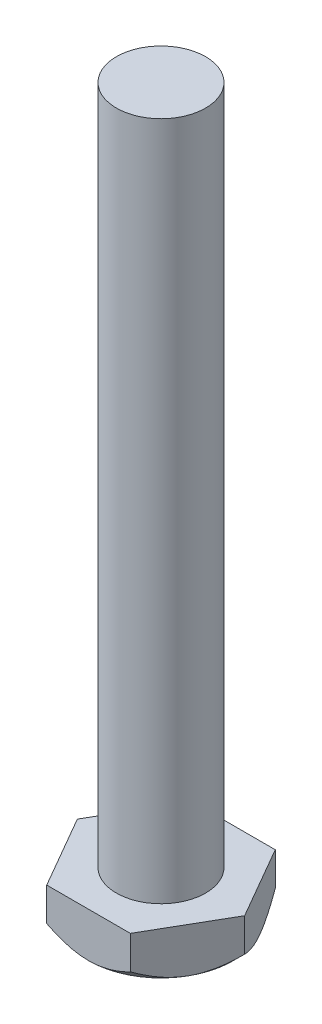
ISO-10303-21;
HEADER;
FILE_DESCRIPTION(('STEP AP214'),'2;1');
FILE_NAME('part.step','',(''),(''),'','','');
FILE_SCHEMA(('AUTOMOTIVE_DESIGN { 1 0 10303 214 1 1 1 1 }'));
ENDSEC;
DATA;
#1=APPLICATION_CONTEXT('core data for automotive mechanical design processes');
#2=APPLICATION_PROTOCOL_DEFINITION('international standard','automotive_design',2000,#1);
#3=PRODUCT_CONTEXT('',#1,'mechanical');
#4=PRODUCT('Part','Part','',(#3));
#5=PRODUCT_RELATED_PRODUCT_CATEGORY('part','',(#4));
#6=PRODUCT_DEFINITION_FORMATION('','',#4);
#7=PRODUCT_DEFINITION_CONTEXT('part definition',#1,'design');
#8=PRODUCT_DEFINITION('design','',#6,#7);
#9=PRODUCT_DEFINITION_SHAPE('','',#8);
#10=(LENGTH_UNIT() NAMED_UNIT(*) SI_UNIT(.MILLI.,.METRE.));
#11=(NAMED_UNIT(*) PLANE_ANGLE_UNIT() SI_UNIT($,.RADIAN.));
#12=(NAMED_UNIT(*) SI_UNIT($,.STERADIAN.) SOLID_ANGLE_UNIT());
#13=UNCERTAINTY_MEASURE_WITH_UNIT(LENGTH_MEASURE(1.E-05),#10,'distance_accuracy_value','');
#14=(GEOMETRIC_REPRESENTATION_CONTEXT(3) GLOBAL_UNCERTAINTY_ASSIGNED_CONTEXT((#13)) GLOBAL_UNIT_ASSIGNED_CONTEXT((#10,
#11,#12)) REPRESENTATION_CONTEXT('',''));
#15=CARTESIAN_POINT('',(0.,0.,0.));
#16=DIRECTION('',(0.,0.,1.));
#17=DIRECTION('',(1.,0.,0.));
#18=AXIS2_PLACEMENT_3D('',#15,#16,#17);
#19=CARTESIAN_POINT('',(3.75277674973264,4.,6.49999999999995));
#20=DIRECTION('',(-0.866025403784441,0.,-0.499999999999995));
#21=DIRECTION('',(-0.499999999999995,0.,0.866025403784442));
#22=AXIS2_PLACEMENT_3D('',#19,#20,#21);
#23=PLANE('',#22);
#24=CARTESIAN_POINT('',(7.50566896951896,1.0056689721836,-0.000200000000000188));
#25=CARTESIAN_POINT('',(7.44114269273982,0.941149402874407,0.111562789804733));
#26=CARTESIAN_POINT('',(7.37612043724036,0.878609848905481,0.224184639952523));
#27=CARTESIAN_POINT('',(7.2449866664783,0.75809308092131,0.451314993500497));
#28=CARTESIAN_POINT('',(7.1788745798115,0.700118358641629,0.5658244866018));
#29=CARTESIAN_POINT('',(6.97814343618827,0.533450528365053,0.913501026018646));
#30=CARTESIAN_POINT('',(6.84182510054323,0.432724757185491,1.14961130935908));
#31=CARTESIAN_POINT('',(6.56692828231375,0.260238848219232,1.62574656537158));
#32=CARTESIAN_POINT('',(6.42842005976328,0.188044164374394,1.86564984409505));
#33=CARTESIAN_POINT('',(6.21838062585921,0.104532676462896,2.2294488152099));
#34=CARTESIAN_POINT('',(6.14805824913179,0.0808367714070053,2.3512507446108));
#35=CARTESIAN_POINT('',(6.00681807563203,0.0422413530035401,2.59588590118223));
#36=CARTESIAN_POINT('',(5.93590036944922,0.0273405250891793,2.7187189714471));
#37=CARTESIAN_POINT('',(5.76308336321239,0.00235711731830176,3.01804680666123));
#38=CARTESIAN_POINT('',(5.66099785946114,-0.00288483734236224,3.19486408587467));
#39=CARTESIAN_POINT('',(5.45701084907491,0.0059137350142073,3.54817995194772));
#40=CARTESIAN_POINT('',(5.35510941947299,0.0199610212491435,3.72467840538215));
#41=CARTESIAN_POINT('',(5.15226727402367,0.0665100411890715,4.07601130721665));
#42=CARTESIAN_POINT('',(5.05132776109957,0.0990324122885824,4.25084367209243));
#43=CARTESIAN_POINT('',(4.85118364029871,0.180763482077609,4.59750345815574));
#44=CARTESIAN_POINT('',(4.75197890000286,0.229970901261828,4.76933110869983));
#45=CARTESIAN_POINT('',(4.57587338891246,0.331205260894986,5.0743548014013));
#46=CARTESIAN_POINT('',(4.49858265374504,0.380569685623974,5.20822628166561));
#47=CARTESIAN_POINT('',(4.34538863071072,0.487253389448814,5.47356611297694));
#48=CARTESIAN_POINT('',(4.26948538498531,0.544572909707867,5.60503439103272));
#49=CARTESIAN_POINT('',(4.11930541101731,0.665881927007233,5.86515373622469));
#50=CARTESIAN_POINT('',(4.04502441158784,0.72985044836631,5.99381220127353));
#51=CARTESIAN_POINT('',(3.89783787777878,0.863617647857271,6.24874675602078));
#52=CARTESIAN_POINT('',(3.82493153304269,0.933412750560145,6.37502424929781));
#53=CARTESIAN_POINT('',(3.7526612796788,1.0056689721836,6.50019999999995));
#54=B_SPLINE_CURVE_WITH_KNOTS('',3,(#24,#25,#26,#27,#28,#29,#30,#31,#32,#33,#34,#35,#36,#37,#38,
#39,#40,#41,#42,#43,#44,#45,#46,#47,#48,#49,#50,#51,#52,#53),.UNSPECIFIED.,.F.,.F.,(4,2,2,2,2,2,
2,2,2,2,2,2,2,2,4),(0.,0.432821098198447,0.865876839223418,1.73666364694239,2.59362329760354,
3.02126269407583,3.44883815671479,4.06060100939774,4.67257828698745,5.28524051521263,
5.89785577160168,6.38444407043265,6.87104712368545,7.35615917312017,7.84097569580784),.UNSPECIFIED.);
#55=CARTESIAN_POINT('',(7.50555349946513,1.00555349946511,0.));
#56=VERTEX_POINT('',#55);
#57=CARTESIAN_POINT('',(5.62916512459888,0.,3.24999999999998));
#58=VERTEX_POINT('',#57);
#59=EDGE_CURVE('E58',#56,#58,#54,.T.);
#60=ORIENTED_EDGE('',*,*,#59,.F.);
#61=DIRECTION('',(0.,-1.,0.));
#62=VECTOR('',#61,1.);
#63=CARTESIAN_POINT('',(7.50555349946513,4.,0.));
#64=LINE('',#63,#62);
#65=CARTESIAN_POINT('',(7.50555349946513,4.,0.));
#66=VERTEX_POINT('',#65);
#67=EDGE_CURVE('E162',#66,#56,#64,.T.);
#68=ORIENTED_EDGE('',*,*,#67,.F.);
#69=DIRECTION('',(0.499999999999995,0.,-0.866025403784442));
#70=VECTOR('',#69,1.);
#71=CARTESIAN_POINT('',(3.75277674973264,4.,6.49999999999995));
#72=LINE('',#71,#70);
#73=CARTESIAN_POINT('',(3.75277674973264,4.,6.49999999999995));
#74=VERTEX_POINT('',#73);
#75=EDGE_CURVE('E295',#74,#66,#72,.T.);
#76=ORIENTED_EDGE('',*,*,#75,.F.);
#77=DIRECTION('',(0.,-1.,0.));
#78=VECTOR('',#77,1.);
#79=CARTESIAN_POINT('',(3.75277674973264,4.,6.49999999999995));
#80=LINE('',#79,#78);
#81=CARTESIAN_POINT('',(3.75277674973264,1.00555349946511,6.49999999999995));
#82=VERTEX_POINT('',#81);
#83=EDGE_CURVE('E146',#74,#82,#80,.T.);
#84=ORIENTED_EDGE('',*,*,#83,.T.);
#85=EDGE_CURVE('E139',#58,#82,#54,.T.);
#86=ORIENTED_EDGE('',*,*,#85,.F.);
#87=EDGE_LOOP('',(#60,#68,#76,#84,#86));
#88=FACE_BOUND('',#87,.T.);
#89=ADVANCED_FACE('F40',(#88),#23,.F.);
#90=CARTESIAN_POINT('',(7.50555349946513,4.,0.));
#91=DIRECTION('',(-0.866025403784438,0.,0.500000000000001));
#92=DIRECTION('',(0.500000000000001,0.,0.866025403784438));
#93=AXIS2_PLACEMENT_3D('',#90,#91,#92);
#94=PLANE('',#93);
#95=CARTESIAN_POINT('',(3.75266127967871,1.0056689721836,-6.5002));
#96=CARTESIAN_POINT('',(3.81718755645786,0.941149402874405,-6.38843721019527));
#97=CARTESIAN_POINT('',(3.88220981195732,0.878609848905476,-6.27581536004748));
#98=CARTESIAN_POINT('',(4.01334358271938,0.758093080921304,-6.0486850064995));
#99=CARTESIAN_POINT('',(4.07945566938618,0.700118358641621,-5.9341755133982));
#100=CARTESIAN_POINT('',(4.28018681300942,0.533450528365042,-5.58649897398135));
#101=CARTESIAN_POINT('',(4.41650514865445,0.432724757185478,-5.35038869064092));
#102=CARTESIAN_POINT('',(4.69140196688395,0.260238848219214,-4.87425343462841));
#103=CARTESIAN_POINT('',(4.82991018943442,0.188044164374374,-4.63435015590493));
#104=CARTESIAN_POINT('',(5.03994962333849,0.104532676462874,-4.27055118479008));
#105=CARTESIAN_POINT('',(5.11027200006591,0.0808367714069831,-4.14874925538919));
#106=CARTESIAN_POINT('',(5.25151217356568,0.0422413530035163,-3.90411409881775));
#107=CARTESIAN_POINT('',(5.32242987974849,0.0273405250891544,-3.78128102855288));
#108=CARTESIAN_POINT('',(5.49524688598532,0.00235711731827581,-3.48195319333875));
#109=CARTESIAN_POINT('',(5.59733238973657,-0.00288483734238767,-3.30513591412531));
#110=CARTESIAN_POINT('',(5.80131940012281,0.00591373501418112,-2.95182004805227));
#111=CARTESIAN_POINT('',(5.90322082972473,0.0199610212491159,-2.77532159461784));
#112=CARTESIAN_POINT('',(6.10606297517405,0.0665100411890426,-2.42398869278334));
#113=CARTESIAN_POINT('',(6.20700248809814,0.0990324122885535,-2.24915632790756));
#114=CARTESIAN_POINT('',(6.40714660889901,0.18076348207758,-1.90249654184425));
#115=CARTESIAN_POINT('',(6.50635134919486,0.229970901261798,-1.73066889130016));
#116=CARTESIAN_POINT('',(6.68245686028527,0.331205260894957,-1.4256451985987));
#117=CARTESIAN_POINT('',(6.75974759545269,0.380569685623947,-1.29177371833437));
#118=CARTESIAN_POINT('',(6.91294161848702,0.487253389448791,-1.02643388702304));
#119=CARTESIAN_POINT('',(6.98884486421242,0.544572909707847,-0.89496560896725));
#120=CARTESIAN_POINT('',(7.13902483818044,0.665881927007219,-0.63484626377528));
#121=CARTESIAN_POINT('',(7.21330583760991,0.729850448366299,-0.506187798726435));
#122=CARTESIAN_POINT('',(7.36049237141898,0.863617647857267,-0.251253243979176));
#123=CARTESIAN_POINT('',(7.43339871615507,0.933412750560144,-0.124975750702143));
#124=CARTESIAN_POINT('',(7.50566896951896,1.0056689721836,0.00020000000000026));
#125=B_SPLINE_CURVE_WITH_KNOTS('',3,(#95,#96,#97,#98,#99,#100,#101,#102,#103,#104,#105,#106,
#107,#108,#109,#110,#111,#112,#113,#114,#115,#116,#117,#118,#119,#120,#121,#122,#123,#124),
.UNSPECIFIED.,.F.,.F.,(4,2,2,2,2,2,2,2,2,2,2,2,2,2,4),(0.,0.432821098198453,0.86587683922343,
1.73666364694241,2.59362329760358,3.02126269407586,3.44883815671483,4.06060100939778,
4.67257828698749,5.28524051521267,5.89785577160171,6.3844440704327,6.87104712368552,
7.35615917312026,7.84097569580794),.UNSPECIFIED.);
#126=CARTESIAN_POINT('',(3.75277674973255,1.00555349946511,-6.5));
#127=VERTEX_POINT('',#126);
#128=CARTESIAN_POINT('',(5.62916512459886,0.,-3.25000000000001));
#129=VERTEX_POINT('',#128);
#130=EDGE_CURVE('E66',#127,#129,#125,.T.);
#131=ORIENTED_EDGE('',*,*,#130,.F.);
#132=DIRECTION('',(0.,-1.,0.));
#133=VECTOR('',#132,1.);
#134=CARTESIAN_POINT('',(3.75277674973255,4.,-6.5));
#135=LINE('',#134,#133);
#136=CARTESIAN_POINT('',(3.75277674973255,4.,-6.5));
#137=VERTEX_POINT('',#136);
#138=EDGE_CURVE('E159',#137,#127,#135,.T.);
#139=ORIENTED_EDGE('',*,*,#138,.F.);
#140=DIRECTION('',(-0.500000000000001,0.,-0.866025403784438));
#141=VECTOR('',#140,1.);
#142=CARTESIAN_POINT('',(7.50555349946513,4.,0.));
#143=LINE('',#142,#141);
#144=EDGE_CURVE('E296',#66,#137,#143,.T.);
#145=ORIENTED_EDGE('',*,*,#144,.F.);
#146=ORIENTED_EDGE('',*,*,#67,.T.);
#147=EDGE_CURVE('E205',#129,#56,#125,.T.);
#148=ORIENTED_EDGE('',*,*,#147,.F.);
#149=EDGE_LOOP('',(#131,#139,#145,#146,#148));
#150=FACE_BOUND('',#149,.T.);
#151=ADVANCED_FACE('F259',(#150),#94,.F.);
#152=CARTESIAN_POINT('',(3.75277674973255,4.,-6.5));
#153=DIRECTION('',(0.,0.,1.));
#154=DIRECTION('',(1.,0.,0.));
#155=AXIS2_PLACEMENT_3D('',#152,#153,#154);
#156=PLANE('',#155);
#157=CARTESIAN_POINT('',(-12.257877297848,7.37463714297044,-6.49999999999995));
#158=CARTESIAN_POINT('',(-12.0786144527424,7.21626669926706,-6.49999999999995));
#159=CARTESIAN_POINT('',(-11.8989773365282,7.05832020377098,-6.49999999999995));
#160=CARTESIAN_POINT('',(-11.5388532991319,6.74339438513113,-6.49999999999995));
#161=CARTESIAN_POINT('',(-11.3583663667321,6.58641507481787,-6.49999999999995));
#162=CARTESIAN_POINT('',(-10.8153431385367,6.11698954789332,-6.49999999999995));
#163=CARTESIAN_POINT('',(-10.451385856912,5.80618102592782,-6.49999999999995));
#164=CARTESIAN_POINT('',(-9.712810821166,5.18537617821584,-6.49999999999996));
#165=CARTESIAN_POINT('',(-9.33811561999247,4.87547183042592,-6.49999999999996));
#166=CARTESIAN_POINT('',(-8.58232837140268,4.26368607674633,-6.49999999999996));
#167=CARTESIAN_POINT('',(-8.20123778767632,3.96180287486343,-6.49999999999996));
#168=CARTESIAN_POINT('',(-7.62881004902885,3.52170439750737,-6.49999999999996));
#169=CARTESIAN_POINT('',(-7.44075642357074,3.37921757786601,-6.49999999999996));
#170=CARTESIAN_POINT('',(-7.06230131506511,3.09740132203368,-6.49999999999996));
#171=CARTESIAN_POINT('',(-6.87189990270703,2.95807179113673,-6.49999999999996));
#172=CARTESIAN_POINT('',(-6.48823632621301,2.68309877395636,-6.49999999999997));
#173=CARTESIAN_POINT('',(-6.29497216843928,2.54745806290806,-6.49999999999997));
#174=CARTESIAN_POINT('',(-5.90528537918821,2.28078594002991,-6.49999999999997));
#175=CARTESIAN_POINT('',(-5.70886281069725,2.14975443644699,-6.49999999999997));
#176=CARTESIAN_POINT('',(-5.31322817211592,1.89390975989261,-6.49999999999997));
#177=CARTESIAN_POINT('',(-5.11403231933556,1.76907160556493,-6.49999999999997));
#178=CARTESIAN_POINT('',(-4.71141947544237,1.52631126714523,-6.49999999999997));
#179=CARTESIAN_POINT('',(-4.50800203451751,1.40838982520712,-6.49999999999997));
#180=CARTESIAN_POINT('',(-4.09661663066175,1.18133314664702,-6.49999999999997));
#181=CARTESIAN_POINT('',(-3.88865455670888,1.07218730816967,-6.49999999999997));
#182=CARTESIAN_POINT('',(-3.46742405503234,0.864743184214765,-6.49999999999998));
#183=CARTESIAN_POINT('',(-3.25415739730938,0.766441338340335,-6.49999999999998));
#184=CARTESIAN_POINT('',(-2.83635448210288,0.589538565413004,-6.49999999999998));
#185=CARTESIAN_POINT('',(-2.63219405877725,0.510057834807899,-6.49999999999998));
#186=CARTESIAN_POINT('',(-2.21876891448566,0.365526540690359,-6.49999999999998));
#187=CARTESIAN_POINT('',(-2.00950432269849,0.300475612401178,-6.49999999999998));
#188=CARTESIAN_POINT('',(-1.5874297362605,0.187961396848507,-6.49999999999998));
#189=CARTESIAN_POINT('',(-1.37464472488329,0.14040580261359,-6.49999999999998));
#190=CARTESIAN_POINT('',(-0.945577231612609,0.0650260309861006,-6.49999999999998));
#191=CARTESIAN_POINT('',(-0.729295257552785,0.037199014443615,-6.49999999999998));
#192=CARTESIAN_POINT('',(-0.292586234689799,0.00290209125437749,-6.49999999999999));
#193=CARTESIAN_POINT('',(-0.07213983673658,-0.00332688791294952,-6.49999999999999));
#194=CARTESIAN_POINT('',(0.368231291401837,0.0066983795295759,-6.49999999999999));
#195=CARTESIAN_POINT('',(0.588156014841029,0.0229529153131664,-6.49999999999999));
#196=CARTESIAN_POINT('',(1.02618641602243,0.0768982451446449,-6.49999999999999));
#197=CARTESIAN_POINT('',(1.24428159032241,0.114672779444712,-6.49999999999999));
#198=CARTESIAN_POINT('',(1.67624769873432,0.209346557704701,-6.49999999999999));
#199=CARTESIAN_POINT('',(1.89011762963223,0.266250287143196,-6.49999999999999));
#200=CARTESIAN_POINT('',(2.4105279834602,0.426334256625288,-6.5));
#201=CARTESIAN_POINT('',(2.71421266224958,0.53874726670331,-6.5));
#202=CARTESIAN_POINT('',(3.31063302640746,0.789503332084321,-6.5));
#203=CARTESIAN_POINT('',(3.60336017118192,0.927866128498037,-6.5));
#204=CARTESIAN_POINT('',(4.18133418955161,1.22473967674961,-6.5));
#205=CARTESIAN_POINT('',(4.46649966923663,1.38340688038837,-6.5));
#206=CARTESIAN_POINT('',(5.02832154749166,1.71478028036426,-6.5));
#207=CARTESIAN_POINT('',(5.30498091055152,1.88748150743655,-6.50000000000001));
#208=CARTESIAN_POINT('',(5.88304602169086,2.26394314930452,-6.50000000000001));
#209=CARTESIAN_POINT('',(6.18361170490619,2.46898531148202,-6.50000000000001));
#210=CARTESIAN_POINT('',(6.77799667458418,2.88866409616432,-6.50000000000001));
#211=CARTESIAN_POINT('',(7.07181479673363,3.10330235595505,-6.50000000000001));
#212=CARTESIAN_POINT('',(7.65431710997908,3.53999067144228,-6.50000000000001));
#213=CARTESIAN_POINT('',(7.94299600430426,3.7620477641512,-6.50000000000001));
#214=CARTESIAN_POINT('',(8.51600164960845,4.21171212211462,-6.50000000000002));
#215=CARTESIAN_POINT('',(8.80032823653066,4.4393195957519,-6.50000000000002));
#216=CARTESIAN_POINT('',(9.35293754376002,4.88871218817845,-6.50000000000002));
#217=CARTESIAN_POINT('',(9.62137350518937,5.11030932245183,-6.50000000000002));
#218=CARTESIAN_POINT('',(10.1555756083284,5.55670815411302,-6.50000000000002));
#219=CARTESIAN_POINT('',(10.4213416796926,5.78150993556035,-6.50000000000002));
#220=CARTESIAN_POINT('',(10.949977862199,6.23315174604503,-6.50000000000002));
#221=CARTESIAN_POINT('',(11.212853574311,6.45998522969075,-6.50000000000002));
#222=CARTESIAN_POINT('',(11.7367031120537,6.91580200128775,-6.50000000000003));
#223=CARTESIAN_POINT('',(11.997677069744,7.14478513738901,-6.50000000000003));
#224=CARTESIAN_POINT('',(12.2578772978479,7.37463714297044,-6.50000000000003));
#225=B_SPLINE_CURVE_WITH_KNOTS('',3,(#157,#158,#159,#160,#161,#162,#163,#164,#165,#166,#167,
#168,#169,#170,#171,#172,#173,#174,#175,#176,#177,#178,#179,#180,#181,#182,#183,#184,#185,#186,
#187,#188,#189,#190,#191,#192,#193,#194,#195,#196,#197,#198,#199,#200,#201,#202,#203,#204,#205,
#206,#207,#208,#209,#210,#211,#212,#213,#214,#215,#216,#217,#218,#219,#220,#221,#222,#223,#224),
.UNSPECIFIED.,.F.,.F.,(4,2,2,2,2,2,2,2,2,2,2,2,2,2,2,2,2,2,2,2,2,2,2,2,2,2,2,2,2,2,2,2,2,4),(0.,
0.717596745114868,1.43520298932425,2.87098231527432,4.32965602473858,5.78800032614762,
6.49578815940556,7.20355473369043,7.9118398287353,8.62011081633329,9.32524337472437,
10.0304514550019,10.7347943515658,11.4389052993018,12.095719816132,12.7525177271926,
13.4057988526736,14.0589859450329,14.7194363436416,15.3798952367711,16.0429418856771,
16.7061441165826,17.675873747876,18.6463441084639,19.6248017573319,20.6029144442506,
21.6941878900879,22.7856482448939,23.878175044857,24.9707429258457,26.0149681831964,
27.0592208816857,28.100848181947,29.142402447864),.UNSPECIFIED.);
#226=CARTESIAN_POINT('',(-3.75277674973259,1.00555349946511,-6.49999999999997));
#227=VERTEX_POINT('',#226);
#228=CARTESIAN_POINT('',(0.,0.,-6.50000000000001));
#229=VERTEX_POINT('',#228);
#230=EDGE_CURVE('E187',#227,#229,#225,.T.);
#231=ORIENTED_EDGE('',*,*,#230,.F.);
#232=DIRECTION('',(0.,-1.,0.));
#233=VECTOR('',#232,1.);
#234=CARTESIAN_POINT('',(-3.75277674973259,4.,-6.49999999999997));
#235=LINE('',#234,#233);
#236=CARTESIAN_POINT('',(-3.75277674973259,4.,-6.49999999999997));
#237=VERTEX_POINT('',#236);
#238=EDGE_CURVE('E150',#237,#227,#235,.T.);
#239=ORIENTED_EDGE('',*,*,#238,.F.);
#240=DIRECTION('',(-1.,0.,0.));
#241=VECTOR('',#240,1.);
#242=CARTESIAN_POINT('',(3.75277674973255,4.,-6.5));
#243=LINE('',#242,#241);
#244=EDGE_CURVE('E301',#137,#237,#243,.T.);
#245=ORIENTED_EDGE('',*,*,#244,.F.);
#246=ORIENTED_EDGE('',*,*,#138,.T.);
#247=EDGE_CURVE('E200',#229,#127,#225,.T.);
#248=ORIENTED_EDGE('',*,*,#247,.F.);
#249=EDGE_LOOP('',(#231,#239,#245,#246,#248));
#250=FACE_BOUND('',#249,.T.);
#251=ADVANCED_FACE('F262',(#250),#156,.F.);
#252=CARTESIAN_POINT('',(-3.75277674973259,4.,-6.49999999999997));
#253=DIRECTION('',(0.866025403784441,0.,0.499999999999995));
#254=DIRECTION('',(0.499999999999995,0.,-0.866025403784442));
#255=AXIS2_PLACEMENT_3D('',#252,#253,#254);
#256=PLANE('',#255);
#257=CARTESIAN_POINT('',(-7.50566896951896,1.0056689721836,0.000200000000052411));
#258=CARTESIAN_POINT('',(-7.44114269273982,0.941149402874404,-0.111562789804681));
#259=CARTESIAN_POINT('',(-7.37612043724036,0.878609848905476,-0.224184639952472));
#260=CARTESIAN_POINT('',(-7.2449866664783,0.758093080921304,-0.451314993500448));
#261=CARTESIAN_POINT('',(-7.1788745798115,0.700118358641621,-0.565824486601752));
#262=CARTESIAN_POINT('',(-6.97814343618826,0.533450528365042,-0.913501026018603));
#263=CARTESIAN_POINT('',(-6.84182510054323,0.432724757185477,-1.14961130935903));
#264=CARTESIAN_POINT('',(-6.56692828231374,0.260238848219213,-1.62574656537154));
#265=CARTESIAN_POINT('',(-6.42842005976327,0.188044164374373,-1.86564984409502));
#266=CARTESIAN_POINT('',(-6.2183806258592,0.104532676462873,-2.22944881520987));
#267=CARTESIAN_POINT('',(-6.14805824913178,0.0808367714069826,-2.35125074461077));
#268=CARTESIAN_POINT('',(-6.00681807563201,0.042241353003516,-2.59588590118221));
#269=CARTESIAN_POINT('',(-5.9359003694492,0.0273405250891542,-2.71871897144707));
#270=CARTESIAN_POINT('',(-5.76308336321238,0.0023571173182752,-3.01804680666121));
#271=CARTESIAN_POINT('',(-5.66099785946112,-0.00288483734238883,-3.19486408587464));
#272=CARTESIAN_POINT('',(-5.45701084907489,0.00591373501418011,-3.54817995194769));
#273=CARTESIAN_POINT('',(-5.35510941947297,0.0199610212491156,-3.72467840538212));
#274=CARTESIAN_POINT('',(-5.15226727402365,0.0665100411890429,-4.07601130721662));
#275=CARTESIAN_POINT('',(-5.05132776109956,0.0990324122885538,-4.25084367209241));
#276=CARTESIAN_POINT('',(-4.85118364029869,0.18076348207758,-4.59750345815572));
#277=CARTESIAN_POINT('',(-4.75197890000284,0.229970901261799,-4.7693311086998));
#278=CARTESIAN_POINT('',(-4.57587338891244,0.331205260894957,-5.07435480140127));
#279=CARTESIAN_POINT('',(-4.49858265374502,0.380569685623947,-5.2082262816656));
#280=CARTESIAN_POINT('',(-4.34538863071069,0.487253389448791,-5.47356611297693));
#281=CARTESIAN_POINT('',(-4.26948538498529,0.544572909707847,-5.60503439103272));
#282=CARTESIAN_POINT('',(-4.11930541101727,0.665881927007219,-5.86515373622469));
#283=CARTESIAN_POINT('',(-4.0450244115878,0.729850448366299,-5.99381220127354));
#284=CARTESIAN_POINT('',(-3.89783787777873,0.863617647857266,-6.2487467560208));
#285=CARTESIAN_POINT('',(-3.82493153304265,0.933412750560143,-6.37502424929783));
#286=CARTESIAN_POINT('',(-3.75266127967875,1.0056689721836,-6.50019999999997));
#287=B_SPLINE_CURVE_WITH_KNOTS('',3,(#257,#258,#259,#260,#261,#262,#263,#264,#265,#266,#267,
#268,#269,#270,#271,#272,#273,#274,#275,#276,#277,#278,#279,#280,#281,#282,#283,#284,#285,#286),
.UNSPECIFIED.,.F.,.F.,(4,2,2,2,2,2,2,2,2,2,2,2,2,2,4),(0.,0.432821098198452,0.865876839223429,
1.73666364694241,2.59362329760357,3.02126269407586,3.44883815671483,4.06060100939778,
4.67257828698749,5.28524051521267,5.89785577160172,6.38444407043271,6.87104712368552,
7.35615917312026,7.84097569580794),.UNSPECIFIED.);
#288=CARTESIAN_POINT('',(-7.50555349946512,1.00555349946511,0.));
#289=VERTEX_POINT('',#288);
#290=CARTESIAN_POINT('',(-5.62916512459888,0.,-3.24999999999997));
#291=VERTEX_POINT('',#290);
#292=EDGE_CURVE('E196',#289,#291,#287,.T.);
#293=ORIENTED_EDGE('',*,*,#292,.F.);
#294=DIRECTION('',(0.,-1.,0.));
#295=VECTOR('',#294,1.);
#296=CARTESIAN_POINT('',(-7.50555349946512,4.,0.));
#297=LINE('',#296,#295);
#298=CARTESIAN_POINT('',(-7.50555349946512,4.,0.));
#299=VERTEX_POINT('',#298);
#300=EDGE_CURVE('E145',#299,#289,#297,.T.);
#301=ORIENTED_EDGE('',*,*,#300,.F.);
#302=DIRECTION('',(-0.499999999999995,0.,0.866025403784441));
#303=VECTOR('',#302,1.);
#304=CARTESIAN_POINT('',(-3.75277674973259,4.,-6.49999999999997));
#305=LINE('',#304,#303);
#306=EDGE_CURVE('E306',#237,#299,#305,.T.);
#307=ORIENTED_EDGE('',*,*,#306,.F.);
#308=ORIENTED_EDGE('',*,*,#238,.T.);
#309=EDGE_CURVE('E185',#291,#227,#287,.T.);
#310=ORIENTED_EDGE('',*,*,#309,.F.);
#311=EDGE_LOOP('',(#293,#301,#307,#308,#310));
#312=FACE_BOUND('',#311,.T.);
#313=ADVANCED_FACE('F194',(#312),#256,.F.);
#314=CARTESIAN_POINT('',(-7.50555349946512,4.,0.));
#315=DIRECTION('',(0.866025403784435,0.,-0.500000000000007));
#316=DIRECTION('',(-0.500000000000007,0.,-0.866025403784434));
#317=AXIS2_PLACEMENT_3D('',#314,#315,#316);
#318=PLANE('',#317);
#319=CARTESIAN_POINT('',(-3.75266127967866,1.0056689721836,6.50020000000003));
#320=CARTESIAN_POINT('',(-3.81718755645781,0.941149402874403,6.38843721019529));
#321=CARTESIAN_POINT('',(-3.88220981195727,0.878609848905475,6.2758153600475));
#322=CARTESIAN_POINT('',(-4.01334358271933,0.758093080921303,6.04868500649953));
#323=CARTESIAN_POINT('',(-4.07945566938614,0.700118358641621,5.93417551339823));
#324=CARTESIAN_POINT('',(-4.28018681300938,0.533450528365042,5.58649897398138));
#325=CARTESIAN_POINT('',(-4.41650514865442,0.432724757185478,5.35038869064095));
#326=CARTESIAN_POINT('',(-4.69140196688391,0.260238848219212,4.87425343462845));
#327=CARTESIAN_POINT('',(-4.82991018943439,0.188044164374372,4.63435015590497));
#328=CARTESIAN_POINT('',(-5.03994962333846,0.104532676462873,4.27055118479012));
#329=CARTESIAN_POINT('',(-5.11027200006588,0.0808367714069827,4.14874925538922));
#330=CARTESIAN_POINT('',(-5.25151217356565,0.0422413530035159,3.90411409881779));
#331=CARTESIAN_POINT('',(-5.32242987974846,0.0273405250891534,3.78128102855292));
#332=CARTESIAN_POINT('',(-5.49524688598529,0.00235711731827423,3.48195319333879));
#333=CARTESIAN_POINT('',(-5.59733238973654,-0.00288483734238903,3.30513591412535));
#334=CARTESIAN_POINT('',(-5.80131940012279,0.00591373501418033,2.95182004805231));
#335=CARTESIAN_POINT('',(-5.90322082972471,0.0199610212491156,2.77532159461788));
#336=CARTESIAN_POINT('',(-6.10606297517403,0.0665100411890424,2.42398869278339));
#337=CARTESIAN_POINT('',(-6.20700248809813,0.099032412288553,2.2491563279076));
#338=CARTESIAN_POINT('',(-6.407146608899,0.180763482077579,1.90249654184429));
#339=CARTESIAN_POINT('',(-6.50635134919485,0.229970901261798,1.73066889130021));
#340=CARTESIAN_POINT('',(-6.68245686028526,0.331205260894956,1.42564519859874));
#341=CARTESIAN_POINT('',(-6.75974759545268,0.380569685623946,1.29177371833442));
#342=CARTESIAN_POINT('',(-6.91294161848701,0.48725338944879,1.02643388702309));
#343=CARTESIAN_POINT('',(-6.98884486421242,0.544572909707845,0.894965608967299));
#344=CARTESIAN_POINT('',(-7.13902483818043,0.665881927007217,0.63484626377533));
#345=CARTESIAN_POINT('',(-7.21330583760991,0.729850448366297,0.506187798726486));
#346=CARTESIAN_POINT('',(-7.36049237141898,0.863617647857265,0.251253243979228));
#347=CARTESIAN_POINT('',(-7.43339871615506,0.933412750560142,0.124975750702195));
#348=CARTESIAN_POINT('',(-7.50566896951896,1.0056689721836,-0.00019999999994751));
#349=B_SPLINE_CURVE_WITH_KNOTS('',3,(#319,#320,#321,#322,#323,#324,#325,#326,#327,#328,#329,
#330,#331,#332,#333,#334,#335,#336,#337,#338,#339,#340,#341,#342,#343,#344,#345,#346,#347,#348),
.UNSPECIFIED.,.F.,.F.,(4,2,2,2,2,2,2,2,2,2,2,2,2,2,4),(0.,0.432821098198452,0.865876839223428,
1.73666364694241,2.59362329760357,3.02126269407586,3.44883815671483,4.06060100939778,
4.67257828698749,5.28524051521267,5.89785577160171,6.3844440704327,6.87104712368552,
7.35615917312026,7.84097569580794),.UNSPECIFIED.);
#350=CARTESIAN_POINT('',(-3.7527767497325,1.00555349946511,6.50000000000003));
#351=VERTEX_POINT('',#350);
#352=CARTESIAN_POINT('',(-5.62916512459884,0.,3.25000000000005));
#353=VERTEX_POINT('',#352);
#354=EDGE_CURVE('E119',#351,#353,#349,.T.);
#355=ORIENTED_EDGE('',*,*,#354,.F.);
#356=DIRECTION('',(0.,-1.,0.));
#357=VECTOR('',#356,1.);
#358=CARTESIAN_POINT('',(-3.7527767497325,4.,6.50000000000003));
#359=LINE('',#358,#357);
#360=CARTESIAN_POINT('',(-3.7527767497325,4.,6.50000000000003));
#361=VERTEX_POINT('',#360);
#362=EDGE_CURVE('E134',#361,#351,#359,.T.);
#363=ORIENTED_EDGE('',*,*,#362,.F.);
#364=DIRECTION('',(0.500000000000007,0.,0.866025403784435));
#365=VECTOR('',#364,1.);
#366=CARTESIAN_POINT('',(-7.50555349946512,4.,0.));
#367=LINE('',#366,#365);
#368=EDGE_CURVE('E309',#299,#361,#367,.T.);
#369=ORIENTED_EDGE('',*,*,#368,.F.);
#370=ORIENTED_EDGE('',*,*,#300,.T.);
#371=EDGE_CURVE('E137',#353,#289,#349,.T.);
#372=ORIENTED_EDGE('',*,*,#371,.F.);
#373=EDGE_LOOP('',(#355,#363,#369,#370,#372));
#374=FACE_BOUND('',#373,.T.);
#375=ADVANCED_FACE('F132',(#374),#318,.F.);
#376=CARTESIAN_POINT('',(-3.7527767497325,4.,6.50000000000003));
#377=DIRECTION('',(0.,0.,-1.));
#378=DIRECTION('',(-1.,0.,0.));
#379=AXIS2_PLACEMENT_3D('',#376,#377,#378);
#380=PLANE('',#379);
#381=CARTESIAN_POINT('',(12.257877297848,7.37463714297044,6.49999999999986));
#382=CARTESIAN_POINT('',(12.0786144527424,7.21626669926706,6.49999999999986));
#383=CARTESIAN_POINT('',(11.8989773365282,7.05832020377098,6.49999999999986));
#384=CARTESIAN_POINT('',(11.538853299132,6.74339438513113,6.49999999999986));
#385=CARTESIAN_POINT('',(11.3583663667321,6.58641507481787,6.49999999999987));
#386=CARTESIAN_POINT('',(10.8153431385368,6.11698954789332,6.49999999999987));
#387=CARTESIAN_POINT('',(10.451385856912,5.80618102592782,6.49999999999988));
#388=CARTESIAN_POINT('',(9.71281082116604,5.18537617821584,6.49999999999988));
#389=CARTESIAN_POINT('',(9.33811561999251,4.87547183042592,6.49999999999989));
#390=CARTESIAN_POINT('',(8.58232837140272,4.26368607674633,6.4999999999999));
#391=CARTESIAN_POINT('',(8.20123778767637,3.96180287486343,6.4999999999999));
#392=CARTESIAN_POINT('',(7.6288100490289,3.52170439750736,6.49999999999991));
#393=CARTESIAN_POINT('',(7.44075642357079,3.379217577866,6.49999999999991));
#394=CARTESIAN_POINT('',(7.06230131506516,3.09740132203368,6.49999999999991));
#395=CARTESIAN_POINT('',(6.87189990270707,2.95807179113672,6.49999999999991));
#396=CARTESIAN_POINT('',(6.48823632621305,2.68309877395636,6.49999999999992));
#397=CARTESIAN_POINT('',(6.29497216843932,2.54745806290806,6.49999999999992));
#398=CARTESIAN_POINT('',(5.90528537918826,2.28078594002991,6.49999999999992));
#399=CARTESIAN_POINT('',(5.70886281069729,2.14975443644698,6.49999999999993));
#400=CARTESIAN_POINT('',(5.31322817211596,1.8939097598926,6.49999999999993));
#401=CARTESIAN_POINT('',(5.1140323193356,1.76907160556493,6.49999999999993));
#402=CARTESIAN_POINT('',(4.71141947544241,1.52631126714523,6.49999999999994));
#403=CARTESIAN_POINT('',(4.50800203451755,1.40838982520711,6.49999999999994));
#404=CARTESIAN_POINT('',(4.09661663066179,1.18133314664702,6.49999999999994));
#405=CARTESIAN_POINT('',(3.88865455670892,1.07218730816967,6.49999999999994));
#406=CARTESIAN_POINT('',(3.46742405503238,0.864743184214762,6.49999999999995));
#407=CARTESIAN_POINT('',(3.25415739730942,0.766441338340332,6.49999999999995));
#408=CARTESIAN_POINT('',(2.83635448210292,0.589538565413,6.49999999999996));
#409=CARTESIAN_POINT('',(2.63219405877729,0.510057834807895,6.49999999999996));
#410=CARTESIAN_POINT('',(2.2187689144857,0.365526540690355,6.49999999999996));
#411=CARTESIAN_POINT('',(2.00950432269853,0.300475612401175,6.49999999999997));
#412=CARTESIAN_POINT('',(1.58742973626054,0.187961396848505,6.49999999999997));
#413=CARTESIAN_POINT('',(1.37464472488333,0.140405802613589,6.49999999999997));
#414=CARTESIAN_POINT('',(0.945577231612648,0.0650260309860992,6.49999999999998));
#415=CARTESIAN_POINT('',(0.729295257552825,0.0371990144436129,6.49999999999998));
#416=CARTESIAN_POINT('',(0.292586234689839,0.00290209125437571,6.49999999999998));
#417=CARTESIAN_POINT('',(0.0721398367366203,-0.00332688791295028,6.49999999999998));
#418=CARTESIAN_POINT('',(-0.368231291401797,0.00669837952957531,6.49999999999999));
#419=CARTESIAN_POINT('',(-0.58815601484099,0.022952915313165,6.49999999999999));
#420=CARTESIAN_POINT('',(-1.02618641602239,0.076898245144644,6.5));
#421=CARTESIAN_POINT('',(-1.24428159032236,0.114672779444712,6.5));
#422=CARTESIAN_POINT('',(-1.67624769873428,0.209346557704703,6.5));
#423=CARTESIAN_POINT('',(-1.89011762963219,0.266250287143198,6.50000000000001));
#424=CARTESIAN_POINT('',(-2.41052798346016,0.426334256625289,6.50000000000001));
#425=CARTESIAN_POINT('',(-2.71421266224954,0.538747266703311,6.50000000000001));
#426=CARTESIAN_POINT('',(-3.31063302640742,0.789503332084322,6.50000000000002));
#427=CARTESIAN_POINT('',(-3.60336017118188,0.927866128498038,6.50000000000002));
#428=CARTESIAN_POINT('',(-4.18133418955157,1.22473967674961,6.50000000000003));
#429=CARTESIAN_POINT('',(-4.46649966923659,1.38340688038837,6.50000000000003));
#430=CARTESIAN_POINT('',(-5.02832154749162,1.71478028036427,6.50000000000004));
#431=CARTESIAN_POINT('',(-5.30498091055148,1.88748150743656,6.50000000000004));
#432=CARTESIAN_POINT('',(-5.88304602169082,2.26394314930452,6.50000000000005));
#433=CARTESIAN_POINT('',(-6.18361170490615,2.46898531148202,6.50000000000005));
#434=CARTESIAN_POINT('',(-6.77799667458414,2.88866409616432,6.50000000000006));
#435=CARTESIAN_POINT('',(-7.07181479673359,3.10330235595506,6.50000000000006));
#436=CARTESIAN_POINT('',(-7.65431710997904,3.53999067144228,6.50000000000007));
#437=CARTESIAN_POINT('',(-7.94299600430422,3.7620477641512,6.50000000000007));
#438=CARTESIAN_POINT('',(-8.5160016496084,4.21171212211462,6.50000000000008));
#439=CARTESIAN_POINT('',(-8.80032823653062,4.4393195957519,6.50000000000008));
#440=CARTESIAN_POINT('',(-9.35293754375997,4.88871218817844,6.50000000000008));
#441=CARTESIAN_POINT('',(-9.62137350518932,5.11030932245182,6.50000000000009));
#442=CARTESIAN_POINT('',(-10.1555756083283,5.55670815411302,6.50000000000009));
#443=CARTESIAN_POINT('',(-10.4213416796926,5.78150993556035,6.5000000000001));
#444=CARTESIAN_POINT('',(-10.949977862199,6.23315174604503,6.5000000000001));
#445=CARTESIAN_POINT('',(-11.2128535743109,6.45998522969075,6.5000000000001));
#446=CARTESIAN_POINT('',(-11.7367031120536,6.91580200128775,6.50000000000011));
#447=CARTESIAN_POINT('',(-11.997677069744,7.14478513738901,6.50000000000011));
#448=CARTESIAN_POINT('',(-12.2578772978479,7.37463714297044,6.50000000000012));
#449=B_SPLINE_CURVE_WITH_KNOTS('',3,(#381,#382,#383,#384,#385,#386,#387,#388,#389,#390,#391,
#392,#393,#394,#395,#396,#397,#398,#399,#400,#401,#402,#403,#404,#405,#406,#407,#408,#409,#410,
#411,#412,#413,#414,#415,#416,#417,#418,#419,#420,#421,#422,#423,#424,#425,#426,#427,#428,#429,
#430,#431,#432,#433,#434,#435,#436,#437,#438,#439,#440,#441,#442,#443,#444,#445,#446,#447,#448),
.UNSPECIFIED.,.F.,.F.,(4,2,2,2,2,2,2,2,2,2,2,2,2,2,2,2,2,2,2,2,2,2,2,2,2,2,2,2,2,2,2,2,2,4),(0.,
0.717596745114869,1.43520298932425,2.87098231527432,4.32965602473858,5.78800032614762,
6.49578815940556,7.20355473369043,7.91183982873531,8.6201108163333,9.32524337472437,
10.0304514550019,10.7347943515658,11.4389052993018,12.095719816132,12.7525177271926,
13.4057988526736,14.0589859450329,14.7194363436416,15.3798952367711,16.0429418856772,
16.7061441165826,17.675873747876,18.6463441084639,19.6248017573319,20.6029144442506,
21.6941878900879,22.7856482448939,23.878175044857,24.9707429258457,26.0149681831964,
27.0592208816857,28.100848181947,29.142402447864),.UNSPECIFIED.);
#450=CARTESIAN_POINT('',(0.,0.,6.49999999999999));
#451=VERTEX_POINT('',#450);
#452=EDGE_CURVE('E126',#82,#451,#449,.T.);
#453=ORIENTED_EDGE('',*,*,#452,.F.);
#454=ORIENTED_EDGE('',*,*,#83,.F.);
#455=DIRECTION('',(1.,0.,0.));
#456=VECTOR('',#455,1.);
#457=CARTESIAN_POINT('',(-3.7527767497325,4.,6.50000000000003));
#458=LINE('',#457,#456);
#459=EDGE_CURVE('E143',#361,#74,#458,.T.);
#460=ORIENTED_EDGE('',*,*,#459,.F.);
#461=ORIENTED_EDGE('',*,*,#362,.T.);
#462=EDGE_CURVE('E116',#451,#351,#449,.T.);
#463=ORIENTED_EDGE('',*,*,#462,.F.);
#464=EDGE_LOOP('',(#453,#454,#460,#461,#463));
#465=FACE_BOUND('',#464,.T.);
#466=ADVANCED_FACE('F141',(#465),#380,.F.);
#467=CARTESIAN_POINT('',(0.,4.,0.));
#468=DIRECTION('',(0.,1.,0.));
#469=DIRECTION('',(0.,0.,1.));
#470=AXIS2_PLACEMENT_3D('',#467,#468,#469);
#471=PLANE('',#470);
#472=CARTESIAN_POINT('',(0.,4.,0.));
#473=DIRECTION('',(0.,1.,0.));
#474=DIRECTION('',(0.,0.,1.));
#475=AXIS2_PLACEMENT_3D('',#472,#473,#474);
#476=CIRCLE('',#475,4.);
#477=CARTESIAN_POINT('',(0.,4.,-4.));
#478=VERTEX_POINT('',#477);
#479=EDGE_CURVE('E12',#478,#478,#476,.T.);
#480=ORIENTED_EDGE('',*,*,#479,.F.);
#481=EDGE_LOOP('',(#480));
#482=FACE_BOUND('',#481,.T.);
#483=ORIENTED_EDGE('',*,*,#75,.T.);
#484=ORIENTED_EDGE('',*,*,#144,.T.);
#485=ORIENTED_EDGE('',*,*,#244,.T.);
#486=ORIENTED_EDGE('',*,*,#306,.T.);
#487=ORIENTED_EDGE('',*,*,#368,.T.);
#488=ORIENTED_EDGE('',*,*,#459,.T.);
#489=EDGE_LOOP('',(#483,#484,#485,#486,#487,#488));
#490=FACE_BOUND('',#489,.T.);
#491=ADVANCED_FACE('F242',(#482,#490),#471,.T.);
#492=CARTESIAN_POINT('',(0.,0.,0.));
#493=DIRECTION('',(0.,1.,0.));
#494=DIRECTION('',(0.,0.,-1.));
#495=AXIS2_PLACEMENT_3D('',#492,#493,#494);
#496=CONICAL_SURFACE('',#495,6.50000000000001,0.78539816339745);
#497=ORIENTED_EDGE('',*,*,#354,.T.);
#498=CARTESIAN_POINT('',(0.,0.,0.));
#499=DIRECTION('',(0.,1.,0.));
#500=DIRECTION('',(0.,0.,1.));
#501=AXIS2_PLACEMENT_3D('',#498,#499,#500);
#502=CIRCLE('',#501,6.50000000000001);
#503=EDGE_CURVE('E44',#353,#451,#502,.T.);
#504=ORIENTED_EDGE('',*,*,#503,.T.);
#505=ORIENTED_EDGE('',*,*,#462,.T.);
#506=EDGE_LOOP('',(#497,#504,#505));
#507=FACE_BOUND('',#506,.T.);
#508=ADVANCED_FACE('F118',(#507),#496,.T.);
#509=ORIENTED_EDGE('',*,*,#292,.T.);
#510=EDGE_CURVE('E169',#291,#353,#502,.T.);
#511=ORIENTED_EDGE('',*,*,#510,.T.);
#512=ORIENTED_EDGE('',*,*,#371,.T.);
#513=EDGE_LOOP('',(#509,#511,#512));
#514=FACE_BOUND('',#513,.T.);
#515=ADVANCED_FACE('F239',(#514),#496,.T.);
#516=ORIENTED_EDGE('',*,*,#230,.T.);
#517=EDGE_CURVE('E171',#229,#291,#502,.T.);
#518=ORIENTED_EDGE('',*,*,#517,.T.);
#519=ORIENTED_EDGE('',*,*,#309,.T.);
#520=EDGE_LOOP('',(#516,#518,#519));
#521=FACE_BOUND('',#520,.T.);
#522=ADVANCED_FACE('F183',(#521),#496,.T.);
#523=ORIENTED_EDGE('',*,*,#247,.T.);
#524=ORIENTED_EDGE('',*,*,#130,.T.);
#525=CARTESIAN_POINT('',(0.,0.,0.));
#526=DIRECTION('',(0.,-1.,0.));
#527=DIRECTION('',(0.,0.,-1.));
#528=AXIS2_PLACEMENT_3D('',#525,#526,#527);
#529=CIRCLE('',#528,6.50000000000001);
#530=EDGE_CURVE('E127',#229,#129,#529,.T.);
#531=ORIENTED_EDGE('',*,*,#530,.F.);
#532=EDGE_LOOP('',(#523,#524,#531));
#533=FACE_BOUND('',#532,.T.);
#534=ADVANCED_FACE('F238',(#533),#496,.T.);
#535=ORIENTED_EDGE('',*,*,#147,.T.);
#536=ORIENTED_EDGE('',*,*,#59,.T.);
#537=EDGE_CURVE('E173',#58,#129,#502,.T.);
#538=ORIENTED_EDGE('',*,*,#537,.T.);
#539=EDGE_LOOP('',(#535,#536,#538));
#540=FACE_BOUND('',#539,.T.);
#541=ADVANCED_FACE('F313',(#540),#496,.T.);
#542=ORIENTED_EDGE('',*,*,#85,.T.);
#543=ORIENTED_EDGE('',*,*,#452,.T.);
#544=EDGE_CURVE('E50',#451,#58,#502,.T.);
#545=ORIENTED_EDGE('',*,*,#544,.T.);
#546=EDGE_LOOP('',(#542,#543,#545));
#547=FACE_BOUND('',#546,.T.);
#548=ADVANCED_FACE('F315',(#547),#496,.T.);
#549=CARTESIAN_POINT('',(0.,0.,0.));
#550=DIRECTION('',(0.,1.,0.));
#551=DIRECTION('',(0.,0.,1.));
#552=AXIS2_PLACEMENT_3D('',#549,#550,#551);
#553=PLANE('',#552);
#554=ORIENTED_EDGE('',*,*,#544,.F.);
#555=ORIENTED_EDGE('',*,*,#503,.F.);
#556=ORIENTED_EDGE('',*,*,#510,.F.);
#557=ORIENTED_EDGE('',*,*,#517,.F.);
#558=ORIENTED_EDGE('',*,*,#530,.T.);
#559=ORIENTED_EDGE('',*,*,#537,.F.);
#560=EDGE_LOOP('',(#554,#555,#556,#557,#558,#559));
#561=FACE_BOUND('',#560,.T.);
#562=ADVANCED_FACE('F190',(#561),#553,.F.);
#563=CARTESIAN_POINT('',(0.,65.,0.));
#564=DIRECTION('',(0.,-1.,0.));
#565=DIRECTION('',(0.,0.,-1.));
#566=AXIS2_PLACEMENT_3D('',#563,#564,#565);
#567=CYLINDRICAL_SURFACE('',#566,4.);
#568=CARTESIAN_POINT('',(0.,65.,0.));
#569=DIRECTION('',(0.,1.,0.));
#570=DIRECTION('',(0.,0.,1.));
#571=AXIS2_PLACEMENT_3D('',#568,#569,#570);
#572=CIRCLE('',#571,4.);
#573=CARTESIAN_POINT('',(0.,65.,-4.));
#574=VERTEX_POINT('',#573);
#575=EDGE_CURVE('E281',#574,#574,#572,.T.);
#576=CARTESIAN_POINT('',(0.,65.,-4.));
#577=CARTESIAN_POINT('',(0.,64.3645833333333,-4.));
#578=CARTESIAN_POINT('',(0.,63.7291666666667,-4.));
#579=CARTESIAN_POINT('',(0.,62.4583333333333,-4.));
#580=CARTESIAN_POINT('',(0.,61.8229166666667,-4.));
#581=CARTESIAN_POINT('',(0.,60.5520833333333,-4.));
#582=CARTESIAN_POINT('',(0.,59.9166666666667,-4.));
#583=CARTESIAN_POINT('',(0.,58.6458333333333,-4.));
#584=CARTESIAN_POINT('',(0.,58.0104166666667,-4.));
#585=CARTESIAN_POINT('',(0.,56.7395833333333,-4.));
#586=CARTESIAN_POINT('',(0.,56.1041666666667,-4.));
#587=CARTESIAN_POINT('',(0.,54.8333333333333,-4.));
#588=CARTESIAN_POINT('',(0.,54.1979166666667,-4.));
#589=CARTESIAN_POINT('',(0.,52.9270833333333,-4.));
#590=CARTESIAN_POINT('',(0.,52.2916666666667,-4.));
#591=CARTESIAN_POINT('',(0.,51.0208333333333,-4.));
#592=CARTESIAN_POINT('',(0.,50.3854166666667,-4.));
#593=CARTESIAN_POINT('',(0.,49.1145833333333,-4.));
#594=CARTESIAN_POINT('',(0.,48.4791666666667,-4.));
#595=CARTESIAN_POINT('',(0.,47.2083333333333,-4.));
#596=CARTESIAN_POINT('',(0.,46.5729166666667,-4.));
#597=CARTESIAN_POINT('',(0.,45.3020833333333,-4.));
#598=CARTESIAN_POINT('',(0.,44.6666666666667,-4.));
#599=CARTESIAN_POINT('',(0.,43.3958333333333,-4.));
#600=CARTESIAN_POINT('',(0.,42.7604166666667,-4.));
#601=CARTESIAN_POINT('',(0.,41.4895833333333,-4.));
#602=CARTESIAN_POINT('',(0.,40.8541666666667,-4.));
#603=CARTESIAN_POINT('',(0.,39.5833333333333,-4.));
#604=CARTESIAN_POINT('',(0.,38.9479166666667,-4.));
#605=CARTESIAN_POINT('',(0.,37.6770833333333,-4.));
#606=CARTESIAN_POINT('',(0.,37.0416666666667,-4.));
#607=CARTESIAN_POINT('',(0.,35.7708333333333,-4.));
#608=CARTESIAN_POINT('',(0.,35.1354166666667,-4.));
#609=CARTESIAN_POINT('',(0.,33.8645833333333,-4.));
#610=CARTESIAN_POINT('',(0.,33.2291666666667,-4.));
#611=CARTESIAN_POINT('',(0.,31.9583333333333,-4.));
#612=CARTESIAN_POINT('',(0.,31.3229166666667,-4.));
#613=CARTESIAN_POINT('',(0.,30.0520833333333,-4.));
#614=CARTESIAN_POINT('',(0.,29.4166666666667,-4.));
#615=CARTESIAN_POINT('',(0.,28.1458333333333,-4.));
#616=CARTESIAN_POINT('',(0.,27.5104166666667,-4.));
#617=CARTESIAN_POINT('',(0.,26.2395833333333,-4.));
#618=CARTESIAN_POINT('',(0.,25.6041666666667,-4.));
#619=CARTESIAN_POINT('',(0.,24.3333333333333,-4.));
#620=CARTESIAN_POINT('',(0.,23.6979166666667,-4.));
#621=CARTESIAN_POINT('',(0.,22.4270833333333,-4.));
#622=CARTESIAN_POINT('',(0.,21.7916666666667,-4.));
#623=CARTESIAN_POINT('',(0.,20.5208333333333,-4.));
#624=CARTESIAN_POINT('',(0.,19.8854166666667,-4.));
#625=CARTESIAN_POINT('',(0.,18.6145833333333,-4.));
#626=CARTESIAN_POINT('',(0.,17.9791666666667,-4.));
#627=CARTESIAN_POINT('',(0.,16.7083333333333,-4.));
#628=CARTESIAN_POINT('',(0.,16.0729166666667,-4.));
#629=CARTESIAN_POINT('',(0.,14.8020833333333,-4.));
#630=CARTESIAN_POINT('',(0.,14.1666666666667,-4.));
#631=CARTESIAN_POINT('',(0.,12.8958333333333,-4.));
#632=CARTESIAN_POINT('',(0.,12.2604166666667,-4.));
#633=CARTESIAN_POINT('',(0.,10.9895833333333,-4.));
#634=CARTESIAN_POINT('',(0.,10.3541666666667,-4.));
#635=CARTESIAN_POINT('',(0.,9.08333333333333,-4.));
#636=CARTESIAN_POINT('',(0.,8.44791666666667,-4.));
#637=CARTESIAN_POINT('',(0.,7.17708333333333,-4.));
#638=CARTESIAN_POINT('',(0.,6.54166666666666,-4.));
#639=CARTESIAN_POINT('',(0.,5.27083333333333,-4.));
#640=CARTESIAN_POINT('',(0.,4.63541666666666,-4.));
#641=CARTESIAN_POINT('',(0.,4.,-4.));
#642=B_SPLINE_CURVE_WITH_KNOTS('',3,(#576,#577,#578,#579,#580,#581,#582,#583,#584,#585,#586,
#587,#588,#589,#590,#591,#592,#593,#594,#595,#596,#597,#598,#599,#600,#601,#602,#603,#604,#605,
#606,#607,#608,#609,#610,#611,#612,#613,#614,#615,#616,#617,#618,#619,#620,#621,#622,#623,#624,
#625,#626,#627,#628,#629,#630,#631,#632,#633,#634,#635,#636,#637,#638,#639,#640,#641),
.UNSPECIFIED.,.F.,.F.,(4,2,2,2,2,2,2,2,2,2,2,2,2,2,2,2,2,2,2,2,2,2,2,2,2,2,2,2,2,2,2,2,4),(0.,
1.90625,3.8125,5.71874999999999,7.62499999999999,9.53124999999999,11.4375,13.34375,15.25,
17.15625,19.0625,20.96875,22.875,24.78125,26.6875,28.59375,30.5,32.40625,34.3125,36.21875,
38.125,40.03125,41.9375,43.84375,45.75,47.65625,49.5625,51.46875,53.375,55.28125,57.1875,
59.09375,61.),.UNSPECIFIED.);
#643=EDGE_CURVE('BSEAM240',#574,#478,#642,.T.);
#644=ORIENTED_EDGE('',*,*,#575,.F.);
#645=ORIENTED_EDGE('',*,*,#479,.T.);
#646=ORIENTED_EDGE('',*,*,#643,.T.);
#647=ORIENTED_EDGE('',*,*,#643,.F.);
#648=EDGE_LOOP('',(#644,#646,#645,#647));
#649=FACE_BOUND('',#648,.T.);
#650=ADVANCED_FACE('F240',(#649),#567,.T.);
#651=CARTESIAN_POINT('',(0.,65.,0.));
#652=DIRECTION('',(0.,1.,0.));
#653=DIRECTION('',(0.,0.,1.));
#654=AXIS2_PLACEMENT_3D('',#651,#652,#653);
#655=PLANE('',#654);
#656=ORIENTED_EDGE('',*,*,#575,.T.);
#657=EDGE_LOOP('',(#656));
#658=FACE_BOUND('',#657,.T.);
#659=ADVANCED_FACE('F286',(#658),#655,.T.);
#660=CLOSED_SHELL('',(#89,#151,#251,#313,#375,#466,#491,#508,#515,#522,#534,#541,#548,#562,#650,#659));
#661=MANIFOLD_SOLID_BREP('B2',#660);
#662=ADVANCED_BREP_SHAPE_REPRESENTATION('',(#18,#661),#14);
#663=SHAPE_DEFINITION_REPRESENTATION(#9,#662);
ENDSEC;
END-ISO-10303-21;
